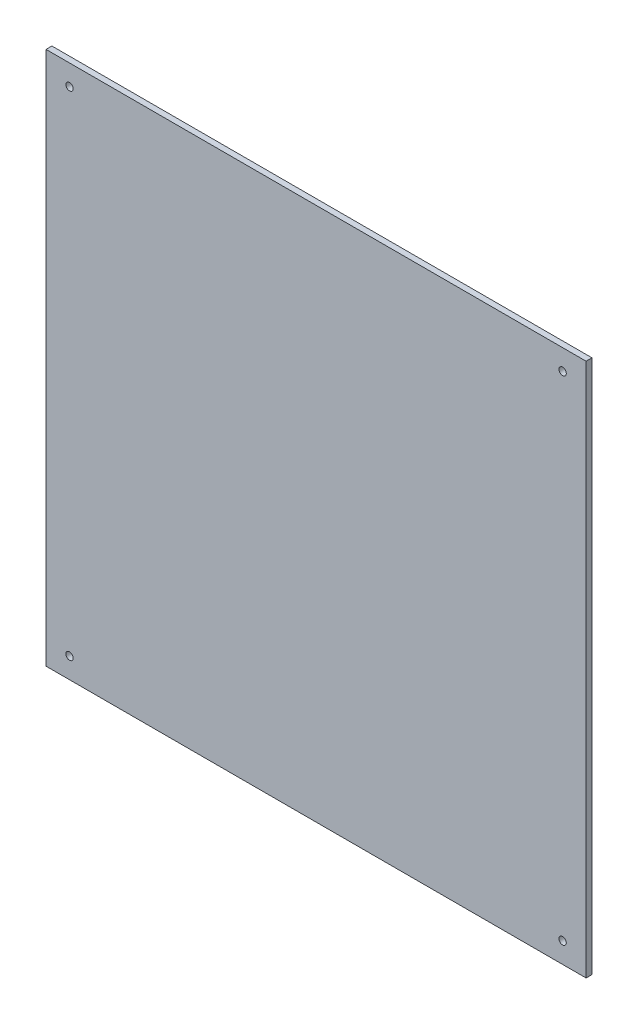
ISO-10303-21;
HEADER;
FILE_DESCRIPTION(('STEP AP214'),'2;1');
FILE_NAME('part.step','',(''),(''),'','','');
FILE_SCHEMA(('AUTOMOTIVE_DESIGN { 1 0 10303 214 1 1 1 1 }'));
ENDSEC;
DATA;
#1=APPLICATION_CONTEXT('core data for automotive mechanical design processes');
#2=APPLICATION_PROTOCOL_DEFINITION('international standard','automotive_design',2000,#1);
#3=PRODUCT_CONTEXT('',#1,'mechanical');
#4=PRODUCT('Part','Part','',(#3));
#5=PRODUCT_RELATED_PRODUCT_CATEGORY('part','',(#4));
#6=PRODUCT_DEFINITION_FORMATION('','',#4);
#7=PRODUCT_DEFINITION_CONTEXT('part definition',#1,'design');
#8=PRODUCT_DEFINITION('design','',#6,#7);
#9=PRODUCT_DEFINITION_SHAPE('','',#8);
#10=(LENGTH_UNIT() NAMED_UNIT(*) SI_UNIT(.MILLI.,.METRE.));
#11=(NAMED_UNIT(*) PLANE_ANGLE_UNIT() SI_UNIT($,.RADIAN.));
#12=(NAMED_UNIT(*) SI_UNIT($,.STERADIAN.) SOLID_ANGLE_UNIT());
#13=UNCERTAINTY_MEASURE_WITH_UNIT(LENGTH_MEASURE(1.E-05),#10,'distance_accuracy_value','');
#14=(GEOMETRIC_REPRESENTATION_CONTEXT(3) GLOBAL_UNCERTAINTY_ASSIGNED_CONTEXT((#13)) GLOBAL_UNIT_ASSIGNED_CONTEXT((#10,
#11,#12)) REPRESENTATION_CONTEXT('',''));
#15=CARTESIAN_POINT('',(0.,0.,0.));
#16=DIRECTION('',(0.,0.,1.));
#17=DIRECTION('',(1.,0.,0.));
#18=AXIS2_PLACEMENT_3D('',#15,#16,#17);
#19=CARTESIAN_POINT('',(0.,0.,2.));
#20=DIRECTION('',(1.,0.,0.));
#21=DIRECTION('',(0.,0.,-1.));
#22=AXIS2_PLACEMENT_3D('',#19,#20,#21);
#23=PLANE('',#22);
#24=DIRECTION('',(0.,-1.,0.));
#25=VECTOR('',#24,1.);
#26=CARTESIAN_POINT('',(0.,0.,0.));
#27=LINE('',#26,#25);
#28=CARTESIAN_POINT('',(0.,182.,0.));
#29=VERTEX_POINT('',#28);
#30=CARTESIAN_POINT('',(0.,0.,0.));
#31=VERTEX_POINT('',#30);
#32=EDGE_CURVE('E98',#29,#31,#27,.T.);
#33=ORIENTED_EDGE('',*,*,#32,.T.);
#34=DIRECTION('',(0.,0.,-1.));
#35=VECTOR('',#34,1.);
#36=CARTESIAN_POINT('',(0.,0.,2.));
#37=LINE('',#36,#35);
#38=CARTESIAN_POINT('',(0.,0.,2.));
#39=VERTEX_POINT('',#38);
#40=EDGE_CURVE('E11',#39,#31,#37,.T.);
#41=ORIENTED_EDGE('',*,*,#40,.F.);
#42=DIRECTION('',(0.,-1.,0.));
#43=VECTOR('',#42,1.);
#44=CARTESIAN_POINT('',(0.,0.,2.));
#45=LINE('',#44,#43);
#46=CARTESIAN_POINT('',(0.,182.,2.));
#47=VERTEX_POINT('',#46);
#48=EDGE_CURVE('E86',#47,#39,#45,.T.);
#49=ORIENTED_EDGE('',*,*,#48,.F.);
#50=DIRECTION('',(0.,0.,-1.));
#51=VECTOR('',#50,1.);
#52=CARTESIAN_POINT('',(0.,182.,2.));
#53=LINE('',#52,#51);
#54=EDGE_CURVE('E94',#47,#29,#53,.T.);
#55=ORIENTED_EDGE('',*,*,#54,.T.);
#56=EDGE_LOOP('',(#33,#41,#49,#55));
#57=FACE_BOUND('',#56,.T.);
#58=ADVANCED_FACE('F35',(#57),#23,.F.);
#59=CARTESIAN_POINT('',(0.,0.,2.));
#60=DIRECTION('',(0.,1.,0.));
#61=DIRECTION('',(0.,0.,1.));
#62=AXIS2_PLACEMENT_3D('',#59,#60,#61);
#63=PLANE('',#62);
#64=DIRECTION('',(1.,0.,0.));
#65=VECTOR('',#64,1.);
#66=CARTESIAN_POINT('',(0.,0.,0.));
#67=LINE('',#66,#65);
#68=CARTESIAN_POINT('',(184.,0.,0.));
#69=VERTEX_POINT('',#68);
#70=EDGE_CURVE('E90',#31,#69,#67,.T.);
#71=ORIENTED_EDGE('',*,*,#70,.T.);
#72=DIRECTION('',(0.,0.,-1.));
#73=VECTOR('',#72,1.);
#74=CARTESIAN_POINT('',(184.,0.,2.));
#75=LINE('',#74,#73);
#76=CARTESIAN_POINT('',(184.,0.,2.));
#77=VERTEX_POINT('',#76);
#78=EDGE_CURVE('E43',#77,#69,#75,.T.);
#79=ORIENTED_EDGE('',*,*,#78,.F.);
#80=DIRECTION('',(1.,0.,0.));
#81=VECTOR('',#80,1.);
#82=CARTESIAN_POINT('',(0.,0.,2.));
#83=LINE('',#82,#81);
#84=EDGE_CURVE('E81',#39,#77,#83,.T.);
#85=ORIENTED_EDGE('',*,*,#84,.F.);
#86=ORIENTED_EDGE('',*,*,#40,.T.);
#87=EDGE_LOOP('',(#71,#79,#85,#86));
#88=FACE_BOUND('',#87,.T.);
#89=ADVANCED_FACE('F89',(#88),#63,.F.);
#90=CARTESIAN_POINT('',(184.,0.,2.));
#91=DIRECTION('',(-1.,0.,0.));
#92=DIRECTION('',(0.,0.,1.));
#93=AXIS2_PLACEMENT_3D('',#90,#91,#92);
#94=PLANE('',#93);
#95=DIRECTION('',(0.,1.,0.));
#96=VECTOR('',#95,1.);
#97=CARTESIAN_POINT('',(184.,0.,0.));
#98=LINE('',#97,#96);
#99=CARTESIAN_POINT('',(184.,182.,0.));
#100=VERTEX_POINT('',#99);
#101=EDGE_CURVE('E68',#69,#100,#98,.T.);
#102=ORIENTED_EDGE('',*,*,#101,.T.);
#103=DIRECTION('',(0.,0.,-1.));
#104=VECTOR('',#103,1.);
#105=CARTESIAN_POINT('',(184.,182.,2.));
#106=LINE('',#105,#104);
#107=CARTESIAN_POINT('',(184.,182.,2.));
#108=VERTEX_POINT('',#107);
#109=EDGE_CURVE('E91',#108,#100,#106,.T.);
#110=ORIENTED_EDGE('',*,*,#109,.F.);
#111=DIRECTION('',(0.,1.,0.));
#112=VECTOR('',#111,1.);
#113=CARTESIAN_POINT('',(184.,0.,2.));
#114=LINE('',#113,#112);
#115=EDGE_CURVE('E84',#77,#108,#114,.T.);
#116=ORIENTED_EDGE('',*,*,#115,.F.);
#117=ORIENTED_EDGE('',*,*,#78,.T.);
#118=EDGE_LOOP('',(#102,#110,#116,#117));
#119=FACE_BOUND('',#118,.T.);
#120=ADVANCED_FACE('F92',(#119),#94,.F.);
#121=CARTESIAN_POINT('',(0.,182.,2.));
#122=DIRECTION('',(0.,-1.,0.));
#123=DIRECTION('',(0.,0.,-1.));
#124=AXIS2_PLACEMENT_3D('',#121,#122,#123);
#125=PLANE('',#124);
#126=DIRECTION('',(-1.,0.,0.));
#127=VECTOR('',#126,1.);
#128=CARTESIAN_POINT('',(0.,182.,0.));
#129=LINE('',#128,#127);
#130=EDGE_CURVE('E74',#100,#29,#129,.T.);
#131=ORIENTED_EDGE('',*,*,#130,.T.);
#132=ORIENTED_EDGE('',*,*,#54,.F.);
#133=DIRECTION('',(-1.,0.,0.));
#134=VECTOR('',#133,1.);
#135=CARTESIAN_POINT('',(0.,182.,2.));
#136=LINE('',#135,#134);
#137=EDGE_CURVE('E51',#108,#47,#136,.T.);
#138=ORIENTED_EDGE('',*,*,#137,.F.);
#139=ORIENTED_EDGE('',*,*,#109,.T.);
#140=EDGE_LOOP('',(#131,#132,#138,#139));
#141=FACE_BOUND('',#140,.T.);
#142=ADVANCED_FACE('F106',(#141),#125,.F.);
#143=CARTESIAN_POINT('',(0.,0.,2.));
#144=DIRECTION('',(0.,0.,-1.));
#145=DIRECTION('',(-1.,0.,0.));
#146=AXIS2_PLACEMENT_3D('',#143,#144,#145);
#147=PLANE('',#146);
#148=CARTESIAN_POINT('',(8.00000000000001,175.,2.));
#149=DIRECTION('',(0.,0.,1.));
#150=DIRECTION('',(1.,0.,0.));
#151=AXIS2_PLACEMENT_3D('',#148,#149,#150);
#152=CIRCLE('',#151,1.24999999999999);
#153=CARTESIAN_POINT('',(9.24999999999999,175.,2.));
#154=VERTEX_POINT('',#153);
#155=EDGE_CURVE('E132',#154,#154,#152,.T.);
#156=ORIENTED_EDGE('',*,*,#155,.F.);
#157=EDGE_LOOP('',(#156));
#158=FACE_BOUND('',#157,.T.);
#159=CARTESIAN_POINT('',(8.,7.,2.));
#160=DIRECTION('',(0.,0.,1.));
#161=DIRECTION('',(1.,0.,0.));
#162=AXIS2_PLACEMENT_3D('',#159,#160,#161);
#163=CIRCLE('',#162,1.24999999999999);
#164=CARTESIAN_POINT('',(9.24999999999999,7.,2.));
#165=VERTEX_POINT('',#164);
#166=EDGE_CURVE('E126',#165,#165,#163,.T.);
#167=ORIENTED_EDGE('',*,*,#166,.F.);
#168=EDGE_LOOP('',(#167));
#169=FACE_BOUND('',#168,.T.);
#170=CARTESIAN_POINT('',(176.,7.,2.));
#171=DIRECTION('',(0.,0.,1.));
#172=DIRECTION('',(1.,0.,0.));
#173=AXIS2_PLACEMENT_3D('',#170,#171,#172);
#174=CIRCLE('',#173,1.24999999999997);
#175=CARTESIAN_POINT('',(177.25,7.,2.));
#176=VERTEX_POINT('',#175);
#177=EDGE_CURVE('E120',#176,#176,#174,.T.);
#178=ORIENTED_EDGE('',*,*,#177,.F.);
#179=EDGE_LOOP('',(#178));
#180=FACE_BOUND('',#179,.T.);
#181=CARTESIAN_POINT('',(176.,175.,2.));
#182=DIRECTION('',(0.,0.,1.));
#183=DIRECTION('',(1.,0.,0.));
#184=AXIS2_PLACEMENT_3D('',#181,#182,#183);
#185=CIRCLE('',#184,1.24999999999997);
#186=CARTESIAN_POINT('',(177.25,175.,2.));
#187=VERTEX_POINT('',#186);
#188=EDGE_CURVE('E114',#187,#187,#185,.T.);
#189=ORIENTED_EDGE('',*,*,#188,.F.);
#190=EDGE_LOOP('',(#189));
#191=FACE_BOUND('',#190,.T.);
#192=ORIENTED_EDGE('',*,*,#48,.T.);
#193=ORIENTED_EDGE('',*,*,#84,.T.);
#194=ORIENTED_EDGE('',*,*,#115,.T.);
#195=ORIENTED_EDGE('',*,*,#137,.T.);
#196=EDGE_LOOP('',(#192,#193,#194,#195));
#197=FACE_BOUND('',#196,.T.);
#198=ADVANCED_FACE('F82',(#158,#169,#180,#191,#197),#147,.F.);
#199=CARTESIAN_POINT('',(0.,0.,0.));
#200=DIRECTION('',(0.,0.,-1.));
#201=DIRECTION('',(-1.,0.,0.));
#202=AXIS2_PLACEMENT_3D('',#199,#200,#201);
#203=PLANE('',#202);
#204=CARTESIAN_POINT('',(8.00000000000001,175.,0.));
#205=DIRECTION('',(0.,0.,1.));
#206=DIRECTION('',(1.,0.,0.));
#207=AXIS2_PLACEMENT_3D('',#204,#205,#206);
#208=CIRCLE('',#207,1.24999999999998);
#209=CARTESIAN_POINT('',(9.24999999999998,175.,0.));
#210=VERTEX_POINT('',#209);
#211=EDGE_CURVE('E129',#210,#210,#208,.T.);
#212=ORIENTED_EDGE('',*,*,#211,.T.);
#213=EDGE_LOOP('',(#212));
#214=FACE_BOUND('',#213,.T.);
#215=CARTESIAN_POINT('',(8.,7.,0.));
#216=DIRECTION('',(0.,0.,1.));
#217=DIRECTION('',(1.,0.,0.));
#218=AXIS2_PLACEMENT_3D('',#215,#216,#217);
#219=CIRCLE('',#218,1.24999999999998);
#220=CARTESIAN_POINT('',(9.24999999999998,7.,0.));
#221=VERTEX_POINT('',#220);
#222=EDGE_CURVE('E123',#221,#221,#219,.T.);
#223=ORIENTED_EDGE('',*,*,#222,.T.);
#224=EDGE_LOOP('',(#223));
#225=FACE_BOUND('',#224,.T.);
#226=CARTESIAN_POINT('',(176.,7.,0.));
#227=DIRECTION('',(0.,0.,1.));
#228=DIRECTION('',(1.,0.,0.));
#229=AXIS2_PLACEMENT_3D('',#226,#227,#228);
#230=CIRCLE('',#229,1.24999999999997);
#231=CARTESIAN_POINT('',(177.25,7.,0.));
#232=VERTEX_POINT('',#231);
#233=EDGE_CURVE('E117',#232,#232,#230,.T.);
#234=ORIENTED_EDGE('',*,*,#233,.T.);
#235=EDGE_LOOP('',(#234));
#236=FACE_BOUND('',#235,.T.);
#237=CARTESIAN_POINT('',(176.,175.,0.));
#238=DIRECTION('',(0.,0.,1.));
#239=DIRECTION('',(1.,0.,0.));
#240=AXIS2_PLACEMENT_3D('',#237,#238,#239);
#241=CIRCLE('',#240,1.24999999999997);
#242=CARTESIAN_POINT('',(177.25,175.,0.));
#243=VERTEX_POINT('',#242);
#244=EDGE_CURVE('E101',#243,#243,#241,.T.);
#245=ORIENTED_EDGE('',*,*,#244,.T.);
#246=EDGE_LOOP('',(#245));
#247=FACE_BOUND('',#246,.T.);
#248=ORIENTED_EDGE('',*,*,#32,.F.);
#249=ORIENTED_EDGE('',*,*,#130,.F.);
#250=ORIENTED_EDGE('',*,*,#101,.F.);
#251=ORIENTED_EDGE('',*,*,#70,.F.);
#252=EDGE_LOOP('',(#248,#249,#250,#251));
#253=FACE_BOUND('',#252,.T.);
#254=ADVANCED_FACE('F109',(#214,#225,#236,#247,#253),#203,.T.);
#255=CARTESIAN_POINT('',(176.,175.,2.));
#256=DIRECTION('',(0.,0.,1.));
#257=DIRECTION('',(1.,0.,0.));
#258=AXIS2_PLACEMENT_3D('',#255,#256,#257);
#259=CYLINDRICAL_SURFACE('',#258,1.24999999999997);
#260=ORIENTED_EDGE('',*,*,#244,.F.);
#261=EDGE_LOOP('',(#260));
#262=FACE_BOUND('',#261,.T.);
#263=ORIENTED_EDGE('',*,*,#188,.T.);
#264=EDGE_LOOP('',(#263));
#265=FACE_BOUND('',#264,.T.);
#266=ADVANCED_FACE('F147',(#262,#265),#259,.F.);
#267=CARTESIAN_POINT('',(176.,7.,2.));
#268=DIRECTION('',(0.,0.,1.));
#269=DIRECTION('',(1.,0.,0.));
#270=AXIS2_PLACEMENT_3D('',#267,#268,#269);
#271=CYLINDRICAL_SURFACE('',#270,1.24999999999997);
#272=ORIENTED_EDGE('',*,*,#233,.F.);
#273=EDGE_LOOP('',(#272));
#274=FACE_BOUND('',#273,.T.);
#275=ORIENTED_EDGE('',*,*,#177,.T.);
#276=EDGE_LOOP('',(#275));
#277=FACE_BOUND('',#276,.T.);
#278=ADVANCED_FACE('F149',(#274,#277),#271,.F.);
#279=CARTESIAN_POINT('',(8.,7.,2.));
#280=DIRECTION('',(0.,0.,1.));
#281=DIRECTION('',(1.,0.,0.));
#282=AXIS2_PLACEMENT_3D('',#279,#280,#281);
#283=CYLINDRICAL_SURFACE('',#282,1.24999999999998);
#284=ORIENTED_EDGE('',*,*,#222,.F.);
#285=EDGE_LOOP('',(#284));
#286=FACE_BOUND('',#285,.T.);
#287=ORIENTED_EDGE('',*,*,#166,.T.);
#288=EDGE_LOOP('',(#287));
#289=FACE_BOUND('',#288,.T.);
#290=ADVANCED_FACE('F156',(#286,#289),#283,.F.);
#291=CARTESIAN_POINT('',(8.00000000000001,175.,2.));
#292=DIRECTION('',(0.,0.,1.));
#293=DIRECTION('',(1.,0.,0.));
#294=AXIS2_PLACEMENT_3D('',#291,#292,#293);
#295=CYLINDRICAL_SURFACE('',#294,1.24999999999998);
#296=ORIENTED_EDGE('',*,*,#211,.F.);
#297=EDGE_LOOP('',(#296));
#298=FACE_BOUND('',#297,.T.);
#299=ORIENTED_EDGE('',*,*,#155,.T.);
#300=EDGE_LOOP('',(#299));
#301=FACE_BOUND('',#300,.T.);
#302=ADVANCED_FACE('F136',(#298,#301),#295,.F.);
#303=CLOSED_SHELL('',(#58,#89,#120,#142,#198,#254,#266,#278,#290,#302));
#304=MANIFOLD_SOLID_BREP('B2',#303);
#305=ADVANCED_BREP_SHAPE_REPRESENTATION('',(#18,#304),#14);
#306=SHAPE_DEFINITION_REPRESENTATION(#9,#305);
ENDSEC;
END-ISO-10303-21;
